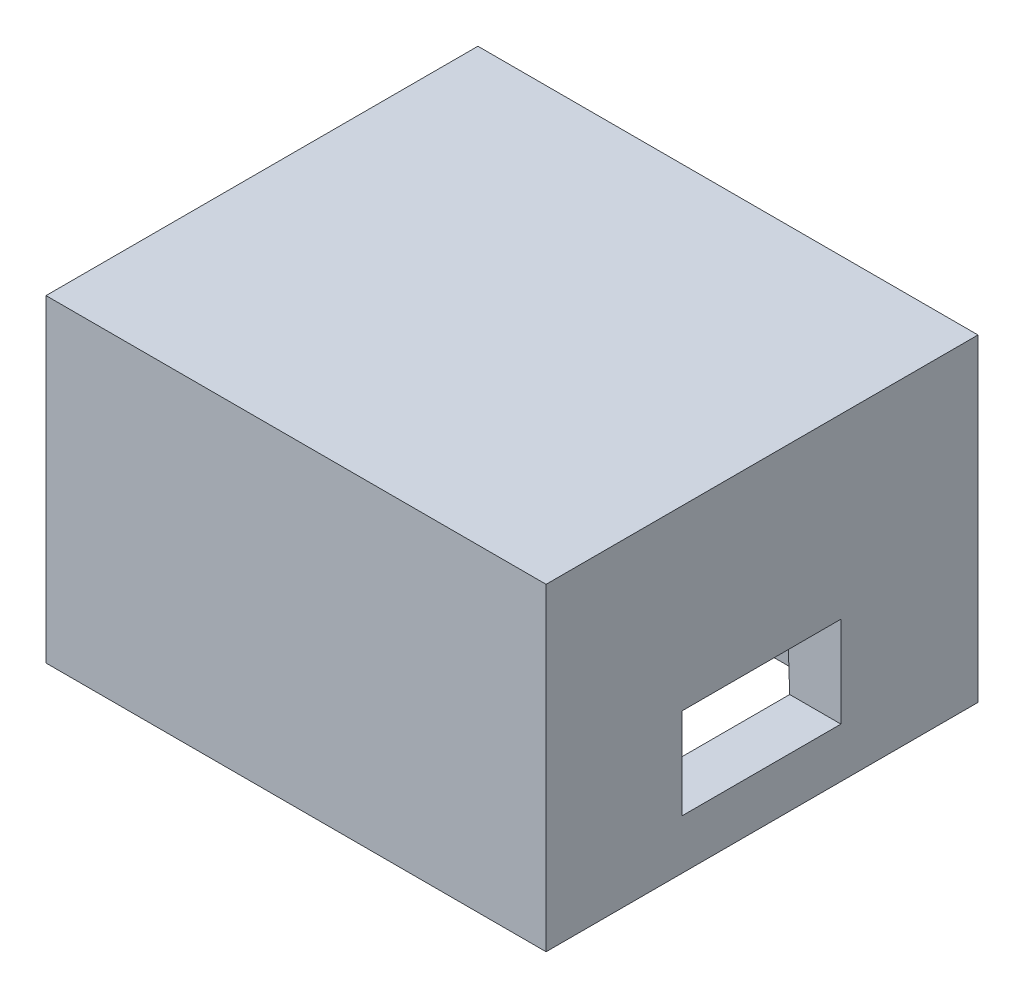
ISO-10303-21;
HEADER;
FILE_DESCRIPTION(('STEP AP214'),'2;1');
FILE_NAME('part.step','',(''),(''),'','','');
FILE_SCHEMA(('AUTOMOTIVE_DESIGN { 1 0 10303 214 1 1 1 1 }'));
ENDSEC;
DATA;
#1=APPLICATION_CONTEXT('core data for automotive mechanical design processes');
#2=APPLICATION_PROTOCOL_DEFINITION('international standard','automotive_design',2000,#1);
#3=PRODUCT_CONTEXT('',#1,'mechanical');
#4=PRODUCT('Part','Part','',(#3));
#5=PRODUCT_RELATED_PRODUCT_CATEGORY('part','',(#4));
#6=PRODUCT_DEFINITION_FORMATION('','',#4);
#7=PRODUCT_DEFINITION_CONTEXT('part definition',#1,'design');
#8=PRODUCT_DEFINITION('design','',#6,#7);
#9=PRODUCT_DEFINITION_SHAPE('','',#8);
#10=(LENGTH_UNIT() NAMED_UNIT(*) SI_UNIT(.MILLI.,.METRE.));
#11=(NAMED_UNIT(*) PLANE_ANGLE_UNIT() SI_UNIT($,.RADIAN.));
#12=(NAMED_UNIT(*) SI_UNIT($,.STERADIAN.) SOLID_ANGLE_UNIT());
#13=UNCERTAINTY_MEASURE_WITH_UNIT(LENGTH_MEASURE(1.E-05),#10,'distance_accuracy_value','');
#14=(GEOMETRIC_REPRESENTATION_CONTEXT(3) GLOBAL_UNCERTAINTY_ASSIGNED_CONTEXT((#13)) GLOBAL_UNIT_ASSIGNED_CONTEXT((#10,
#11,#12)) REPRESENTATION_CONTEXT('',''));
#15=CARTESIAN_POINT('',(0.,0.,0.));
#16=DIRECTION('',(0.,0.,1.));
#17=DIRECTION('',(1.,0.,0.));
#18=AXIS2_PLACEMENT_3D('',#15,#16,#17);
#19=CARTESIAN_POINT('',(43.7308345620287,139.716635550424,17.6499932212532));
#20=DIRECTION('',(0.,-1.,0.));
#21=DIRECTION('',(0.,0.,-1.));
#22=AXIS2_PLACEMENT_3D('',#19,#20,#21);
#23=PLANE('',#22);
#24=DIRECTION('',(0.,0.,-1.));
#25=VECTOR('',#24,1.);
#26=CARTESIAN_POINT('',(55.,139.716635550424,47.5));
#27=LINE('',#26,#25);
#28=CARTESIAN_POINT('',(55.,139.716635550424,17.6499932212532));
#29=VERTEX_POINT('',#28);
#30=CARTESIAN_POINT('',(55.,139.716635550424,-17.3500067787468));
#31=VERTEX_POINT('',#30);
#32=EDGE_CURVE('E212',#29,#31,#27,.T.);
#33=ORIENTED_EDGE('',*,*,#32,.T.);
#34=DIRECTION('',(1.,0.,0.));
#35=VECTOR('',#34,1.);
#36=CARTESIAN_POINT('',(43.7308345620287,139.716635550424,-17.3500067787468));
#37=LINE('',#36,#35);
#38=CARTESIAN_POINT('',(43.7308345620287,139.716635550424,-17.3500067787468));
#39=VERTEX_POINT('',#38);
#40=EDGE_CURVE('E47',#39,#31,#37,.T.);
#41=ORIENTED_EDGE('',*,*,#40,.F.);
#42=DIRECTION('',(0.,0.,-1.));
#43=VECTOR('',#42,1.);
#44=CARTESIAN_POINT('',(43.7308345620287,139.716635550424,-33.6000067787468));
#45=LINE('',#44,#43);
#46=CARTESIAN_POINT('',(43.7308345620287,139.716635550424,17.6499932212532));
#47=VERTEX_POINT('',#46);
#48=EDGE_CURVE('E55',#39,#47,#45,.F.);
#49=ORIENTED_EDGE('',*,*,#48,.T.);
#50=DIRECTION('',(1.,0.,0.));
#51=VECTOR('',#50,1.);
#52=CARTESIAN_POINT('',(43.7308345620287,139.716635550424,17.6499932212532));
#53=LINE('',#52,#51);
#54=EDGE_CURVE('E11',#47,#29,#53,.T.);
#55=ORIENTED_EDGE('',*,*,#54,.T.);
#56=EDGE_LOOP('',(#33,#41,#49,#55));
#57=FACE_BOUND('',#56,.T.);
#58=ADVANCED_FACE('F38',(#57),#23,.F.);
#59=CARTESIAN_POINT('',(43.0328446279787,159.704452090806,17.6499932212532));
#60=DIRECTION('',(0.,0.,1.));
#61=DIRECTION('',(0.,-1.,0.));
#62=AXIS2_PLACEMENT_3D('',#59,#60,#61);
#63=PLANE('',#62);
#64=DIRECTION('',(0.,-1.,0.));
#65=VECTOR('',#64,1.);
#66=CARTESIAN_POINT('',(55.,98.7702927323566,17.6499932212532));
#67=LINE('',#66,#65);
#68=CARTESIAN_POINT('',(55.,159.704452090806,17.6499932212532));
#69=VERTEX_POINT('',#68);
#70=EDGE_CURVE('E216',#69,#29,#67,.T.);
#71=ORIENTED_EDGE('',*,*,#70,.T.);
#72=ORIENTED_EDGE('',*,*,#54,.F.);
#73=DIRECTION('',(0.034899496702501,-0.999390827019096,0.));
#74=VECTOR('',#73,1.);
#75=CARTESIAN_POINT('',(44.1130892763561,128.770292732357,17.6499932212532));
#76=LINE('',#75,#74);
#77=CARTESIAN_POINT('',(43.0328446279787,159.704452090806,17.6499932212532));
#78=VERTEX_POINT('',#77);
#79=EDGE_CURVE('E205',#47,#78,#76,.F.);
#80=ORIENTED_EDGE('',*,*,#79,.T.);
#81=DIRECTION('',(1.,0.,0.));
#82=VECTOR('',#81,1.);
#83=CARTESIAN_POINT('',(43.0328446279787,159.704452090806,17.6499932212532));
#84=LINE('',#83,#82);
#85=EDGE_CURVE('E219',#78,#69,#84,.T.);
#86=ORIENTED_EDGE('',*,*,#85,.T.);
#87=EDGE_LOOP('',(#71,#72,#80,#86));
#88=FACE_BOUND('',#87,.T.);
#89=ADVANCED_FACE('F227',(#88),#63,.F.);
#90=CARTESIAN_POINT('',(43.0328446279787,159.704452090806,17.6499932212532));
#91=DIRECTION('',(0.,1.,0.));
#92=DIRECTION('',(0.,0.,1.));
#93=AXIS2_PLACEMENT_3D('',#90,#91,#92);
#94=PLANE('',#93);
#95=DIRECTION('',(0.,0.,1.));
#96=VECTOR('',#95,1.);
#97=CARTESIAN_POINT('',(55.,159.704452090806,47.5));
#98=LINE('',#97,#96);
#99=CARTESIAN_POINT('',(55.,159.704452090806,-17.3500067787468));
#100=VERTEX_POINT('',#99);
#101=EDGE_CURVE('E213',#100,#69,#98,.T.);
#102=ORIENTED_EDGE('',*,*,#101,.T.);
#103=ORIENTED_EDGE('',*,*,#85,.F.);
#104=DIRECTION('',(0.,0.,1.));
#105=VECTOR('',#104,1.);
#106=CARTESIAN_POINT('',(43.0328446279787,159.704452090806,-33.6000067787468));
#107=LINE('',#106,#105);
#108=CARTESIAN_POINT('',(43.0328446279787,159.704452090806,-17.3500067787468));
#109=VERTEX_POINT('',#108);
#110=EDGE_CURVE('E207',#78,#109,#107,.F.);
#111=ORIENTED_EDGE('',*,*,#110,.T.);
#112=DIRECTION('',(1.,0.,0.));
#113=VECTOR('',#112,1.);
#114=CARTESIAN_POINT('',(43.0328446279787,159.704452090806,-17.3500067787468));
#115=LINE('',#114,#113);
#116=EDGE_CURVE('E204',#109,#100,#115,.T.);
#117=ORIENTED_EDGE('',*,*,#116,.T.);
#118=EDGE_LOOP('',(#102,#103,#111,#117));
#119=FACE_BOUND('',#118,.T.);
#120=ADVANCED_FACE('F237',(#119),#94,.F.);
#121=CARTESIAN_POINT('',(43.0328446279787,159.704452090806,-17.3500067787468));
#122=DIRECTION('',(0.,0.,-1.));
#123=DIRECTION('',(0.,1.,0.));
#124=AXIS2_PLACEMENT_3D('',#121,#122,#123);
#125=PLANE('',#124);
#126=DIRECTION('',(0.,1.,0.));
#127=VECTOR('',#126,1.);
#128=CARTESIAN_POINT('',(55.,98.7702927323566,-17.3500067787468));
#129=LINE('',#128,#127);
#130=EDGE_CURVE('E42',#31,#100,#129,.T.);
#131=ORIENTED_EDGE('',*,*,#130,.T.);
#132=ORIENTED_EDGE('',*,*,#116,.F.);
#133=DIRECTION('',(-0.034899496702501,0.999390827019096,0.));
#134=VECTOR('',#133,1.);
#135=CARTESIAN_POINT('',(44.1130892763561,128.770292732357,-17.3500067787468));
#136=LINE('',#135,#134);
#137=EDGE_CURVE('E209',#109,#39,#136,.F.);
#138=ORIENTED_EDGE('',*,*,#137,.T.);
#139=ORIENTED_EDGE('',*,*,#40,.T.);
#140=EDGE_LOOP('',(#131,#132,#138,#139));
#141=FACE_BOUND('',#140,.T.);
#142=ADVANCED_FACE('F40',(#141),#125,.F.);
#143=CARTESIAN_POINT('',(0.0130892763561168,160.270292732357,21.9935887671255));
#144=DIRECTION('',(1.,0.,0.));
#145=DIRECTION('',(0.,0.,-1.));
#146=AXIS2_PLACEMENT_3D('',#143,#144,#145);
#147=CYLINDRICAL_SURFACE('',#146,10.5);
#148=CARTESIAN_POINT('',(-32.4805062695162,160.270292732357,21.9935887671255));
#149=DIRECTION('',(-1.,0.,0.));
#150=DIRECTION('',(0.,-1.,0.));
#151=AXIS2_PLACEMENT_3D('',#148,#149,#150);
#152=CIRCLE('',#151,10.5);
#153=CARTESIAN_POINT('',(-32.4805062695162,170.770292732357,21.9935887671255));
#154=VERTEX_POINT('',#153);
#155=CARTESIAN_POINT('',(-32.4805062695162,160.636737447733,32.487192450826));
#156=VERTEX_POINT('',#155);
#157=EDGE_CURVE('E787',#154,#156,#152,.F.);
#158=ORIENTED_EDGE('',*,*,#157,.F.);
#159=DIRECTION('',(-1.,0.,0.));
#160=VECTOR('',#159,1.);
#161=CARTESIAN_POINT('',(42.6464169577027,170.770292732357,21.9935887671255));
#162=LINE('',#161,#160);
#163=CARTESIAN_POINT('',(32.5066848222284,170.770292732357,21.9935887671255));
#164=VERTEX_POINT('',#163);
#165=EDGE_CURVE('E756',#154,#164,#162,.F.);
#166=ORIENTED_EDGE('',*,*,#165,.T.);
#167=CARTESIAN_POINT('',(32.5066848222284,160.270292732357,21.9935887671255));
#168=DIRECTION('',(1.,0.,0.));
#169=DIRECTION('',(0.,0.,-1.));
#170=AXIS2_PLACEMENT_3D('',#167,#168,#169);
#171=CIRCLE('',#170,10.5);
#172=CARTESIAN_POINT('',(32.5066848222284,160.636737447733,32.487192450826));
#173=VERTEX_POINT('',#172);
#174=EDGE_CURVE('E751',#173,#164,#171,.F.);
#175=ORIENTED_EDGE('',*,*,#174,.F.);
#176=DIRECTION('',(1.,0.,0.));
#177=VECTOR('',#176,1.);
#178=CARTESIAN_POINT('',(-42.6202384049905,160.636737447733,32.487192450826));
#179=LINE('',#178,#177);
#180=EDGE_CURVE('E735',#173,#156,#179,.F.);
#181=ORIENTED_EDGE('',*,*,#180,.T.);
#182=EDGE_LOOP('',(#158,#166,#175,#181));
#183=FACE_BOUND('',#182,.T.);
#184=ADVANCED_FACE('F246',(#183),#147,.F.);
#185=CARTESIAN_POINT('',(-32.4805062695162,160.270292732357,21.9935887671255));
#186=DIRECTION('',(0.,0.,1.));
#187=DIRECTION('',(1.,0.,0.));
#188=AXIS2_PLACEMENT_3D('',#185,#186,#187);
#189=SPHERICAL_SURFACE('',#188,10.5);
#190=CARTESIAN_POINT('',(-32.4805062695162,160.270292732357,21.9935887671255));
#191=DIRECTION('',(0.,0.,1.));
#192=DIRECTION('',(1.,0.,0.));
#193=AXIS2_PLACEMENT_3D('',#190,#191,#192);
#194=CIRCLE('',#193,10.5);
#195=CARTESIAN_POINT('',(-42.9741099532167,160.636737447733,21.9935887671255));
#196=VERTEX_POINT('',#195);
#197=EDGE_CURVE('E780',#154,#196,#194,.T.);
#198=ORIENTED_EDGE('',*,*,#197,.F.);
#199=ORIENTED_EDGE('',*,*,#157,.T.);
#200=CARTESIAN_POINT('',(-32.4805062695162,160.270292732357,21.9935887671255));
#201=DIRECTION('',(0.0348782627423747,0.998782765958718,-0.0348782627423747));
#202=DIRECTION('',(0.,0.0348994967025011,0.999390827019096));
#203=AXIS2_PLACEMENT_3D('',#200,#201,#202);
#204=CIRCLE('',#203,10.5);
#205=EDGE_CURVE('E783',#196,#156,#204,.T.);
#206=ORIENTED_EDGE('',*,*,#205,.F.);
#207=EDGE_LOOP('',(#198,#199,#206));
#208=FACE_BOUND('',#207,.T.);
#209=ADVANCED_FACE('F350',(#208),#189,.F.);
#210=CARTESIAN_POINT('',(-32.4805062695162,160.270292732357,-6.77874678040114E-06));
#211=DIRECTION('',(0.,0.,1.));
#212=DIRECTION('',(1.,0.,0.));
#213=AXIS2_PLACEMENT_3D('',#210,#211,#212);
#214=CYLINDRICAL_SURFACE('',#213,10.5);
#215=CARTESIAN_POINT('',(-32.4805062695162,160.270292732357,-21.9936023246191));
#216=DIRECTION('',(0.,0.,-1.));
#217=DIRECTION('',(-1.,0.,0.));
#218=AXIS2_PLACEMENT_3D('',#215,#216,#217);
#219=CIRCLE('',#218,10.5);
#220=CARTESIAN_POINT('',(-32.4805062695162,170.770292732357,-21.9936023246191));
#221=VERTEX_POINT('',#220);
#222=CARTESIAN_POINT('',(-42.9741099532167,160.636737447733,-21.9936023246191));
#223=VERTEX_POINT('',#222);
#224=EDGE_CURVE('E773',#221,#223,#219,.F.);
#225=ORIENTED_EDGE('',*,*,#224,.F.);
#226=DIRECTION('',(0.,0.,-1.));
#227=VECTOR('',#226,1.);
#228=CARTESIAN_POINT('',(-32.4805062695162,170.770292732357,32.1333209025998));
#229=LINE('',#228,#227);
#230=EDGE_CURVE('E774',#221,#154,#229,.F.);
#231=ORIENTED_EDGE('',*,*,#230,.T.);
#232=ORIENTED_EDGE('',*,*,#197,.T.);
#233=DIRECTION('',(0.,0.,1.));
#234=VECTOR('',#233,1.);
#235=CARTESIAN_POINT('',(-42.9741099532167,160.636737447733,-32.1333344600934));
#236=LINE('',#235,#234);
#237=EDGE_CURVE('E733',#196,#223,#236,.F.);
#238=ORIENTED_EDGE('',*,*,#237,.T.);
#239=EDGE_LOOP('',(#225,#231,#232,#238));
#240=FACE_BOUND('',#239,.T.);
#241=ADVANCED_FACE('F346',(#240),#214,.F.);
#242=CARTESIAN_POINT('',(-32.4805062695162,160.270292732357,-21.9936023246191));
#243=DIRECTION('',(0.,0.,1.));
#244=DIRECTION('',(1.,0.,0.));
#245=AXIS2_PLACEMENT_3D('',#242,#243,#244);
#246=SPHERICAL_SURFACE('',#245,10.5);
#247=CARTESIAN_POINT('',(-32.4805062695162,160.270292732357,-21.9936023246191));
#248=DIRECTION('',(-1.,0.,0.));
#249=DIRECTION('',(0.,0.,1.));
#250=AXIS2_PLACEMENT_3D('',#247,#248,#249);
#251=CIRCLE('',#250,10.5);
#252=CARTESIAN_POINT('',(-32.4805062695162,160.636737447733,-32.4872060083196));
#253=VERTEX_POINT('',#252);
#254=EDGE_CURVE('E769',#221,#253,#251,.T.);
#255=ORIENTED_EDGE('',*,*,#254,.F.);
#256=ORIENTED_EDGE('',*,*,#224,.T.);
#257=CARTESIAN_POINT('',(-32.4805062695162,160.270292732357,-21.9936023246191));
#258=DIRECTION('',(0.0348782627423747,0.998782765958718,0.0348782627423747));
#259=DIRECTION('',(0.,-0.034899496702501,0.999390827019096));
#260=AXIS2_PLACEMENT_3D('',#257,#258,#259);
#261=CIRCLE('',#260,10.5);
#262=EDGE_CURVE('E688',#253,#223,#261,.T.);
#263=ORIENTED_EDGE('',*,*,#262,.F.);
#264=EDGE_LOOP('',(#255,#256,#263));
#265=FACE_BOUND('',#264,.T.);
#266=ADVANCED_FACE('F342',(#265),#246,.F.);
#267=CARTESIAN_POINT('',(0.0130892763561168,160.270292732357,-21.9936023246191));
#268=DIRECTION('',(-1.,0.,0.));
#269=DIRECTION('',(0.,0.,1.));
#270=AXIS2_PLACEMENT_3D('',#267,#268,#269);
#271=CYLINDRICAL_SURFACE('',#270,10.5);
#272=CARTESIAN_POINT('',(32.5066848222284,160.270292732357,-21.9936023246191));
#273=DIRECTION('',(1.,0.,0.));
#274=DIRECTION('',(0.,1.,0.));
#275=AXIS2_PLACEMENT_3D('',#272,#273,#274);
#276=CIRCLE('',#275,10.5);
#277=CARTESIAN_POINT('',(32.5066848222284,160.636737447733,-32.4872060083196));
#278=VERTEX_POINT('',#277);
#279=CARTESIAN_POINT('',(32.5066848222284,170.770292732357,-21.9936023246191));
#280=VERTEX_POINT('',#279);
#281=EDGE_CURVE('E763',#278,#280,#276,.T.);
#282=ORIENTED_EDGE('',*,*,#281,.T.);
#283=DIRECTION('',(1.,0.,0.));
#284=VECTOR('',#283,1.);
#285=CARTESIAN_POINT('',(-42.6202384049905,170.770292732357,-21.9936023246191));
#286=LINE('',#285,#284);
#287=EDGE_CURVE('E755',#280,#221,#286,.F.);
#288=ORIENTED_EDGE('',*,*,#287,.T.);
#289=ORIENTED_EDGE('',*,*,#254,.T.);
#290=DIRECTION('',(-1.,0.,0.));
#291=VECTOR('',#290,1.);
#292=CARTESIAN_POINT('',(42.6464169577027,160.636737447733,-32.4872060083196));
#293=LINE('',#292,#291);
#294=EDGE_CURVE('E676',#253,#278,#293,.F.);
#295=ORIENTED_EDGE('',*,*,#294,.T.);
#296=EDGE_LOOP('',(#282,#288,#289,#295));
#297=FACE_BOUND('',#296,.T.);
#298=ADVANCED_FACE('F322',(#297),#271,.F.);
#299=CARTESIAN_POINT('',(0.0130892763561168,170.770292732357,-6.77874678040114E-06));
#300=DIRECTION('',(0.,1.,0.));
#301=DIRECTION('',(0.,0.,1.));
#302=AXIS2_PLACEMENT_3D('',#299,#300,#301);
#303=PLANE('',#302);
#304=ORIENTED_EDGE('',*,*,#230,.F.);
#305=ORIENTED_EDGE('',*,*,#287,.F.);
#306=DIRECTION('',(0.,0.,1.));
#307=VECTOR('',#306,1.);
#308=CARTESIAN_POINT('',(32.5066848222284,170.770292732357,-32.1333344600934));
#309=LINE('',#308,#307);
#310=EDGE_CURVE('E752',#164,#280,#309,.F.);
#311=ORIENTED_EDGE('',*,*,#310,.F.);
#312=ORIENTED_EDGE('',*,*,#165,.F.);
#313=EDGE_LOOP('',(#304,#305,#311,#312));
#314=FACE_BOUND('',#313,.T.);
#315=ADVANCED_FACE('F319',(#314),#303,.F.);
#316=CARTESIAN_POINT('',(32.5066848222284,160.270292732357,-21.9936023246191));
#317=DIRECTION('',(0.,0.,1.));
#318=DIRECTION('',(1.,0.,0.));
#319=AXIS2_PLACEMENT_3D('',#316,#317,#318);
#320=SPHERICAL_SURFACE('',#319,10.5);
#321=CARTESIAN_POINT('',(32.5066848222284,160.270292732357,-21.9936023246191));
#322=DIRECTION('',(-0.0348782627423747,0.998782765958718,0.0348782627423747));
#323=DIRECTION('',(0.,-0.0348994967025011,0.999390827019096));
#324=AXIS2_PLACEMENT_3D('',#321,#322,#323);
#325=CIRCLE('',#324,10.5);
#326=CARTESIAN_POINT('',(43.0002885059289,160.636737447733,-21.9936023246191));
#327=VERTEX_POINT('',#326);
#328=EDGE_CURVE('E663',#327,#278,#325,.T.);
#329=ORIENTED_EDGE('',*,*,#328,.F.);
#330=CARTESIAN_POINT('',(32.5066848222284,160.270292732357,-21.9936023246191));
#331=DIRECTION('',(0.,0.,-1.));
#332=DIRECTION('',(-1.,0.,0.));
#333=AXIS2_PLACEMENT_3D('',#330,#331,#332);
#334=CIRCLE('',#333,10.5);
#335=EDGE_CURVE('E758',#327,#280,#334,.F.);
#336=ORIENTED_EDGE('',*,*,#335,.T.);
#337=ORIENTED_EDGE('',*,*,#281,.F.);
#338=EDGE_LOOP('',(#329,#336,#337));
#339=FACE_BOUND('',#338,.T.);
#340=ADVANCED_FACE('F317',(#339),#320,.F.);
#341=CARTESIAN_POINT('',(32.5066848222284,160.270292732357,21.9935887671255));
#342=DIRECTION('',(0.,0.,1.));
#343=DIRECTION('',(1.,0.,0.));
#344=AXIS2_PLACEMENT_3D('',#341,#342,#343);
#345=SPHERICAL_SURFACE('',#344,10.5);
#346=CARTESIAN_POINT('',(32.5066848222284,160.270292732357,21.9935887671255));
#347=DIRECTION('',(-0.0348782627423747,0.998782765958718,-0.0348782627423747));
#348=DIRECTION('',(0.,0.034899496702501,0.999390827019096));
#349=AXIS2_PLACEMENT_3D('',#346,#347,#348);
#350=CIRCLE('',#349,10.5);
#351=CARTESIAN_POINT('',(43.0002885059289,160.636737447733,21.9935887671255));
#352=VERTEX_POINT('',#351);
#353=EDGE_CURVE('E729',#173,#352,#350,.T.);
#354=ORIENTED_EDGE('',*,*,#353,.F.);
#355=ORIENTED_EDGE('',*,*,#174,.T.);
#356=CARTESIAN_POINT('',(32.5066848222284,160.270292732357,21.9935887671255));
#357=DIRECTION('',(0.,0.,1.));
#358=DIRECTION('',(1.,0.,0.));
#359=AXIS2_PLACEMENT_3D('',#356,#357,#358);
#360=CIRCLE('',#359,10.5);
#361=EDGE_CURVE('E745',#352,#164,#360,.T.);
#362=ORIENTED_EDGE('',*,*,#361,.F.);
#363=EDGE_LOOP('',(#354,#355,#362));
#364=FACE_BOUND('',#363,.T.);
#365=ADVANCED_FACE('F313',(#364),#345,.F.);
#366=CARTESIAN_POINT('',(-44.0869107236439,128.770292732357,33.5999932212532));
#367=DIRECTION('',(0.,0.034899496702501,0.999390827019096));
#368=DIRECTION('',(0.,-0.999390827019096,0.034899496702501));
#369=AXIS2_PLACEMENT_3D('',#366,#367,#368);
#370=PLANE('',#369);
#371=ORIENTED_EDGE('',*,*,#180,.F.);
#372=DIRECTION('',(-0.0348782627423747,0.998782765958718,-0.0348782627423747));
#373=VECTOR('',#372,1.);
#374=CARTESIAN_POINT('',(33.5249562890136,131.477257814107,33.5054639176112));
#375=LINE('',#374,#373);
#376=CARTESIAN_POINT('',(33.6194855926556,128.770292732357,33.5999932212532));
#377=VERTEX_POINT('',#376);
#378=EDGE_CURVE('E744',#377,#173,#375,.T.);
#379=ORIENTED_EDGE('',*,*,#378,.F.);
#380=DIRECTION('',(1.,0.,0.));
#381=VECTOR('',#380,1.);
#382=CARTESIAN_POINT('',(-44.0869107236439,128.770292732357,33.5999932212532));
#383=LINE('',#382,#381);
#384=CARTESIAN_POINT('',(-33.5933070399434,128.770292732357,33.5999932212532));
#385=VERTEX_POINT('',#384);
#386=EDGE_CURVE('E252',#385,#377,#383,.T.);
#387=ORIENTED_EDGE('',*,*,#386,.F.);
#388=DIRECTION('',(0.0348782627423747,0.998782765958718,-0.0348782627423747));
#389=VECTOR('',#388,1.);
#390=CARTESIAN_POINT('',(-33.6060724375932,128.404739571998,33.6127586189031));
#391=LINE('',#390,#389);
#392=EDGE_CURVE('E265',#156,#385,#391,.F.);
#393=ORIENTED_EDGE('',*,*,#392,.F.);
#394=EDGE_LOOP('',(#371,#379,#387,#393));
#395=FACE_BOUND('',#394,.T.);
#396=ADVANCED_FACE('F316',(#395),#370,.F.);
#397=CARTESIAN_POINT('',(-33.6060724375932,128.038294856622,23.1191549352026));
#398=DIRECTION('',(-0.0348782627423747,-0.998782765958718,0.0348782627423747));
#399=DIRECTION('',(0.,-0.034899496702501,-0.999390827019096));
#400=AXIS2_PLACEMENT_3D('',#397,#398,#399);
#401=CYLINDRICAL_SURFACE('',#400,10.5);
#402=CARTESIAN_POINT('',(-33.5805105085063,128.770292732357,23.0935930061156));
#403=DIRECTION('',(0.,1.,0.));
#404=DIRECTION('',(-0.707106781186548,0.,0.707106781186547));
#405=AXIS2_PLACEMENT_3D('',#402,#403,#404);
#406=ELLIPSE('',#405,10.51279653381,10.5);
#407=CARTESIAN_POINT('',(-44.0869107236439,128.770292732357,23.1063895375527));
#408=VERTEX_POINT('',#407);
#409=EDGE_CURVE('E250',#385,#408,#406,.F.);
#410=ORIENTED_EDGE('',*,*,#409,.T.);
#411=DIRECTION('',(0.0348782627423747,0.998782765958718,-0.0348782627423747));
#412=VECTOR('',#411,1.);
#413=CARTESIAN_POINT('',(-44.0179277774523,130.7457058517,23.0374065913611));
#414=LINE('',#413,#412);
#415=EDGE_CURVE('E700',#408,#196,#414,.T.);
#416=ORIENTED_EDGE('',*,*,#415,.T.);
#417=ORIENTED_EDGE('',*,*,#205,.T.);
#418=ORIENTED_EDGE('',*,*,#392,.T.);
#419=EDGE_LOOP('',(#410,#416,#417,#418));
#420=FACE_BOUND('',#419,.T.);
#421=ADVANCED_FACE('F332',(#420),#401,.F.);
#422=CARTESIAN_POINT('',(-44.0869107236439,128.770292732357,-33.6000067787468));
#423=DIRECTION('',(-0.999390827019096,0.034899496702501,0.));
#424=DIRECTION('',(-0.034899496702501,-0.999390827019096,0.));
#425=AXIS2_PLACEMENT_3D('',#422,#423,#424);
#426=PLANE('',#425);
#427=DIRECTION('',(0.,0.,1.));
#428=VECTOR('',#427,1.);
#429=CARTESIAN_POINT('',(-44.0869107236439,128.770292732357,-33.6000067787468));
#430=LINE('',#429,#428);
#431=CARTESIAN_POINT('',(-44.0869107236439,128.770292732357,-23.1064030950463));
#432=VERTEX_POINT('',#431);
#433=EDGE_CURVE('E695',#432,#408,#430,.T.);
#434=ORIENTED_EDGE('',*,*,#433,.F.);
#435=DIRECTION('',(0.0348782627423747,0.998782765958718,0.0348782627423747));
#436=VECTOR('',#435,1.);
#437=CARTESIAN_POINT('',(-44.0996761212937,128.404739571998,-23.1191684926961));
#438=LINE('',#437,#436);
#439=EDGE_CURVE('E689',#223,#432,#438,.F.);
#440=ORIENTED_EDGE('',*,*,#439,.F.);
#441=ORIENTED_EDGE('',*,*,#237,.F.);
#442=ORIENTED_EDGE('',*,*,#415,.F.);
#443=EDGE_LOOP('',(#434,#440,#441,#442));
#444=FACE_BOUND('',#443,.T.);
#445=ADVANCED_FACE('F329',(#444),#426,.F.);
#446=CARTESIAN_POINT('',(-33.6060724375932,128.038294856622,-23.1191684926961));
#447=DIRECTION('',(-0.0348782627423747,-0.998782765958718,-0.0348782627423747));
#448=DIRECTION('',(0.,0.034899496702501,-0.999390827019096));
#449=AXIS2_PLACEMENT_3D('',#446,#447,#448);
#450=CYLINDRICAL_SURFACE('',#449,10.5);
#451=CARTESIAN_POINT('',(-33.5805105085063,128.770292732357,-23.0936065636092));
#452=DIRECTION('',(0.,1.,0.));
#453=DIRECTION('',(-0.707106781186548,0.,-0.707106781186548));
#454=AXIS2_PLACEMENT_3D('',#451,#452,#453);
#455=ELLIPSE('',#454,10.51279653381,10.5);
#456=CARTESIAN_POINT('',(-33.5933070399434,128.770292732357,-33.6000067787468));
#457=VERTEX_POINT('',#456);
#458=EDGE_CURVE('E684',#432,#457,#455,.F.);
#459=ORIENTED_EDGE('',*,*,#458,.T.);
#460=DIRECTION('',(0.0348782627423747,0.998782765958718,0.0348782627423747));
#461=VECTOR('',#460,1.);
#462=CARTESIAN_POINT('',(-33.6060724375932,128.404739571998,-33.6127721763967));
#463=LINE('',#462,#461);
#464=EDGE_CURVE('E677',#457,#253,#463,.T.);
#465=ORIENTED_EDGE('',*,*,#464,.T.);
#466=ORIENTED_EDGE('',*,*,#262,.T.);
#467=ORIENTED_EDGE('',*,*,#439,.T.);
#468=EDGE_LOOP('',(#459,#465,#466,#467));
#469=FACE_BOUND('',#468,.T.);
#470=ADVANCED_FACE('F290',(#469),#450,.F.);
#471=CARTESIAN_POINT('',(-44.0869107236439,128.770292732357,-33.6000067787468));
#472=DIRECTION('',(0.,0.034899496702501,-0.999390827019096));
#473=DIRECTION('',(0.,0.999390827019096,0.034899496702501));
#474=AXIS2_PLACEMENT_3D('',#471,#472,#473);
#475=PLANE('',#474);
#476=DIRECTION('',(-1.,0.,0.));
#477=VECTOR('',#476,1.);
#478=CARTESIAN_POINT('',(-44.0869107236439,128.770292732357,-33.6000067787468));
#479=LINE('',#478,#477);
#480=CARTESIAN_POINT('',(33.6194855926556,128.770292732357,-33.6000067787468));
#481=VERTEX_POINT('',#480);
#482=EDGE_CURVE('E670',#481,#457,#479,.T.);
#483=ORIENTED_EDGE('',*,*,#482,.F.);
#484=DIRECTION('',(-0.0348782627423747,0.998782765958718,0.0348782627423747));
#485=VECTOR('',#484,1.);
#486=CARTESIAN_POINT('',(33.5249562890136,131.477257814107,-33.5054774751048));
#487=LINE('',#486,#485);
#488=EDGE_CURVE('E664',#278,#481,#487,.F.);
#489=ORIENTED_EDGE('',*,*,#488,.F.);
#490=ORIENTED_EDGE('',*,*,#294,.F.);
#491=ORIENTED_EDGE('',*,*,#464,.F.);
#492=EDGE_LOOP('',(#483,#489,#490,#491));
#493=FACE_BOUND('',#492,.T.);
#494=ADVANCED_FACE('F283',(#493),#475,.F.);
#495=CARTESIAN_POINT('',(-55.,98.7702927323566,47.5));
#496=DIRECTION('',(-1.,0.,0.));
#497=DIRECTION('',(0.,0.,1.));
#498=AXIS2_PLACEMENT_3D('',#495,#496,#497);
#499=PLANE('',#498);
#500=DIRECTION('',(0.,0.,-1.));
#501=VECTOR('',#500,1.);
#502=CARTESIAN_POINT('',(-55.,128.770292732357,47.5));
#503=LINE('',#502,#501);
#504=CARTESIAN_POINT('',(-55.,128.770292732357,47.5));
#505=VERTEX_POINT('',#504);
#506=CARTESIAN_POINT('',(-55.,128.770292732357,-47.5));
#507=VERTEX_POINT('',#506);
#508=EDGE_CURVE('E196',#505,#507,#503,.T.);
#509=ORIENTED_EDGE('',*,*,#508,.F.);
#510=DIRECTION('',(0.,1.,0.));
#511=VECTOR('',#510,1.);
#512=CARTESIAN_POINT('',(-55.,98.7702927323566,47.5));
#513=LINE('',#512,#511);
#514=CARTESIAN_POINT('',(-55.,198.770292732357,47.5));
#515=VERTEX_POINT('',#514);
#516=EDGE_CURVE('E197',#505,#515,#513,.T.);
#517=ORIENTED_EDGE('',*,*,#516,.T.);
#518=DIRECTION('',(0.,0.,1.));
#519=VECTOR('',#518,1.);
#520=CARTESIAN_POINT('',(-55.,198.770292732357,47.5));
#521=LINE('',#520,#519);
#522=CARTESIAN_POINT('',(-55.,198.770292732357,-47.5));
#523=VERTEX_POINT('',#522);
#524=EDGE_CURVE('E184',#523,#515,#521,.T.);
#525=ORIENTED_EDGE('',*,*,#524,.F.);
#526=DIRECTION('',(0.,1.,0.));
#527=VECTOR('',#526,1.);
#528=CARTESIAN_POINT('',(-55.,98.7702927323566,-47.5));
#529=LINE('',#528,#527);
#530=EDGE_CURVE('E174',#507,#523,#529,.T.);
#531=ORIENTED_EDGE('',*,*,#530,.F.);
#532=EDGE_LOOP('',(#509,#517,#525,#531));
#533=FACE_BOUND('',#532,.T.);
#534=ADVANCED_FACE('F281',(#533),#499,.T.);
#535=CARTESIAN_POINT('',(-55.,98.7702927323566,47.5));
#536=DIRECTION('',(0.,0.,1.));
#537=DIRECTION('',(1.,0.,0.));
#538=AXIS2_PLACEMENT_3D('',#535,#536,#537);
#539=PLANE('',#538);
#540=DIRECTION('',(-1.,0.,0.));
#541=VECTOR('',#540,1.);
#542=CARTESIAN_POINT('',(-55.,128.770292732357,47.5));
#543=LINE('',#542,#541);
#544=CARTESIAN_POINT('',(55.,128.770292732357,47.5));
#545=VERTEX_POINT('',#544);
#546=EDGE_CURVE('E271',#545,#505,#543,.T.);
#547=ORIENTED_EDGE('',*,*,#546,.F.);
#548=DIRECTION('',(0.,1.,0.));
#549=VECTOR('',#548,1.);
#550=CARTESIAN_POINT('',(55.,98.7702927323566,47.5));
#551=LINE('',#550,#549);
#552=CARTESIAN_POINT('',(55.,198.770292732357,47.5));
#553=VERTEX_POINT('',#552);
#554=EDGE_CURVE('E194',#545,#553,#551,.T.);
#555=ORIENTED_EDGE('',*,*,#554,.T.);
#556=DIRECTION('',(1.,0.,0.));
#557=VECTOR('',#556,1.);
#558=CARTESIAN_POINT('',(-55.,198.770292732357,47.5));
#559=LINE('',#558,#557);
#560=EDGE_CURVE('E175',#515,#553,#559,.T.);
#561=ORIENTED_EDGE('',*,*,#560,.F.);
#562=ORIENTED_EDGE('',*,*,#516,.F.);
#563=EDGE_LOOP('',(#547,#555,#561,#562));
#564=FACE_BOUND('',#563,.T.);
#565=ADVANCED_FACE('F279',(#564),#539,.T.);
#566=CARTESIAN_POINT('',(0.,198.770292732357,0.));
#567=DIRECTION('',(0.,-1.,0.));
#568=DIRECTION('',(0.,0.,-1.));
#569=AXIS2_PLACEMENT_3D('',#566,#567,#568);
#570=PLANE('',#569);
#571=DIRECTION('',(0.,0.,-1.));
#572=VECTOR('',#571,1.);
#573=CARTESIAN_POINT('',(55.,198.770292732357,47.5));
#574=LINE('',#573,#572);
#575=CARTESIAN_POINT('',(55.,198.770292732357,-47.5));
#576=VERTEX_POINT('',#575);
#577=EDGE_CURVE('E169',#553,#576,#574,.T.);
#578=ORIENTED_EDGE('',*,*,#577,.T.);
#579=DIRECTION('',(-1.,0.,0.));
#580=VECTOR('',#579,1.);
#581=CARTESIAN_POINT('',(-55.,198.770292732357,-47.5));
#582=LINE('',#581,#580);
#583=EDGE_CURVE('E178',#576,#523,#582,.T.);
#584=ORIENTED_EDGE('',*,*,#583,.T.);
#585=ORIENTED_EDGE('',*,*,#524,.T.);
#586=ORIENTED_EDGE('',*,*,#560,.T.);
#587=EDGE_LOOP('',(#578,#584,#585,#586));
#588=FACE_BOUND('',#587,.T.);
#589=ADVANCED_FACE('F186',(#588),#570,.F.);
#590=CARTESIAN_POINT('',(-55.,98.7702927323566,-47.5));
#591=DIRECTION('',(0.,0.,-1.));
#592=DIRECTION('',(-1.,0.,0.));
#593=AXIS2_PLACEMENT_3D('',#590,#591,#592);
#594=PLANE('',#593);
#595=DIRECTION('',(1.,0.,0.));
#596=VECTOR('',#595,1.);
#597=CARTESIAN_POINT('',(-55.,128.770292732357,-47.5));
#598=LINE('',#597,#596);
#599=CARTESIAN_POINT('',(55.,128.770292732357,-47.5));
#600=VERTEX_POINT('',#599);
#601=EDGE_CURVE('E200',#507,#600,#598,.T.);
#602=ORIENTED_EDGE('',*,*,#601,.F.);
#603=ORIENTED_EDGE('',*,*,#530,.T.);
#604=ORIENTED_EDGE('',*,*,#583,.F.);
#605=DIRECTION('',(0.,1.,0.));
#606=VECTOR('',#605,1.);
#607=CARTESIAN_POINT('',(55.,98.7702927323566,-47.5));
#608=LINE('',#607,#606);
#609=EDGE_CURVE('E164',#600,#576,#608,.T.);
#610=ORIENTED_EDGE('',*,*,#609,.F.);
#611=EDGE_LOOP('',(#602,#603,#604,#610));
#612=FACE_BOUND('',#611,.T.);
#613=ADVANCED_FACE('F179',(#612),#594,.T.);
#614=CARTESIAN_POINT('',(33.5249562890136,131.110813098731,-23.0118737914043));
#615=DIRECTION('',(0.0348782627423747,-0.998782765958718,-0.0348782627423747));
#616=DIRECTION('',(0.,0.034899496702501,-0.999390827019096));
#617=AXIS2_PLACEMENT_3D('',#614,#615,#616);
#618=CYLINDRICAL_SURFACE('',#617,10.5);
#619=CARTESIAN_POINT('',(33.6066890612185,128.770292732357,-23.0936065636092));
#620=DIRECTION('',(0.,1.,0.));
#621=DIRECTION('',(0.707106781186547,0.,-0.707106781186548));
#622=AXIS2_PLACEMENT_3D('',#619,#620,#621);
#623=ELLIPSE('',#622,10.51279653381,10.5);
#624=CARTESIAN_POINT('',(44.1130892763561,128.770292732357,-23.1064030950463));
#625=VERTEX_POINT('',#624);
#626=EDGE_CURVE('E269',#481,#625,#623,.F.);
#627=ORIENTED_EDGE('',*,*,#626,.T.);
#628=DIRECTION('',(-0.0348782627423747,0.998782765958718,0.0348782627423747));
#629=VECTOR('',#628,1.);
#630=CARTESIAN_POINT('',(44.125854674006,128.404739571998,-23.1191684926961));
#631=LINE('',#630,#629);
#632=EDGE_CURVE('E701',#625,#327,#631,.T.);
#633=ORIENTED_EDGE('',*,*,#632,.T.);
#634=ORIENTED_EDGE('',*,*,#328,.T.);
#635=ORIENTED_EDGE('',*,*,#488,.T.);
#636=EDGE_LOOP('',(#627,#633,#634,#635));
#637=FACE_BOUND('',#636,.T.);
#638=ADVANCED_FACE('F295',(#637),#618,.F.);
#639=CARTESIAN_POINT('',(32.5066848222284,160.270292732357,-6.77874678040114E-06));
#640=DIRECTION('',(0.,0.,-1.));
#641=DIRECTION('',(-1.,0.,0.));
#642=AXIS2_PLACEMENT_3D('',#639,#640,#641);
#643=CYLINDRICAL_SURFACE('',#642,10.5);
#644=ORIENTED_EDGE('',*,*,#335,.F.);
#645=DIRECTION('',(0.,0.,-1.));
#646=VECTOR('',#645,1.);
#647=CARTESIAN_POINT('',(43.0002885059289,160.636737447733,32.1333209025998));
#648=LINE('',#647,#646);
#649=EDGE_CURVE('E712',#327,#352,#648,.F.);
#650=ORIENTED_EDGE('',*,*,#649,.T.);
#651=ORIENTED_EDGE('',*,*,#361,.T.);
#652=ORIENTED_EDGE('',*,*,#310,.T.);
#653=EDGE_LOOP('',(#644,#650,#651,#652));
#654=FACE_BOUND('',#653,.T.);
#655=ADVANCED_FACE('F300',(#654),#643,.F.);
#656=CARTESIAN_POINT('',(33.550502646464,130.379261136324,23.0374065913611));
#657=DIRECTION('',(0.0348782627423747,-0.998782765958718,0.0348782627423747));
#658=DIRECTION('',(0.,-0.034899496702501,-0.999390827019096));
#659=AXIS2_PLACEMENT_3D('',#656,#657,#658);
#660=CYLINDRICAL_SURFACE('',#659,10.5);
#661=CARTESIAN_POINT('',(33.6066890612185,128.770292732357,23.0935930061156));
#662=DIRECTION('',(0.,1.,0.));
#663=DIRECTION('',(0.707106781186548,0.,0.707106781186548));
#664=AXIS2_PLACEMENT_3D('',#661,#662,#663);
#665=ELLIPSE('',#664,10.51279653381,10.5);
#666=CARTESIAN_POINT('',(44.1130892763561,128.770292732357,23.1063895375527));
#667=VERTEX_POINT('',#666);
#668=EDGE_CURVE('E202',#667,#377,#665,.F.);
#669=ORIENTED_EDGE('',*,*,#668,.T.);
#670=ORIENTED_EDGE('',*,*,#378,.T.);
#671=ORIENTED_EDGE('',*,*,#353,.T.);
#672=DIRECTION('',(-0.0348782627423747,0.998782765958718,-0.0348782627423747));
#673=VECTOR('',#672,1.);
#674=CARTESIAN_POINT('',(44.0441063301645,130.7457058517,23.0374065913611));
#675=LINE('',#674,#673);
#676=EDGE_CURVE('E721',#352,#667,#675,.F.);
#677=ORIENTED_EDGE('',*,*,#676,.T.);
#678=EDGE_LOOP('',(#669,#670,#671,#677));
#679=FACE_BOUND('',#678,.T.);
#680=ADVANCED_FACE('F309',(#679),#660,.F.);
#681=CARTESIAN_POINT('',(44.1130892763561,128.770292732357,23.1063895375527));
#682=DIRECTION('',(0.,1.,0.));
#683=DIRECTION('',(-0.707106781186549,0.,0.707106781186546));
#684=AXIS2_PLACEMENT_3D('',#681,#682,#683);
#685=PLANE('',#684);
#686=DIRECTION('',(0.,0.,1.));
#687=VECTOR('',#686,1.);
#688=CARTESIAN_POINT('',(55.,128.770292732357,47.5));
#689=LINE('',#688,#687);
#690=EDGE_CURVE('E171',#600,#545,#689,.T.);
#691=ORIENTED_EDGE('',*,*,#690,.T.);
#692=ORIENTED_EDGE('',*,*,#546,.T.);
#693=ORIENTED_EDGE('',*,*,#508,.T.);
#694=ORIENTED_EDGE('',*,*,#601,.T.);
#695=EDGE_LOOP('',(#691,#692,#693,#694));
#696=FACE_BOUND('',#695,.T.);
#697=ORIENTED_EDGE('',*,*,#668,.F.);
#698=DIRECTION('',(0.,0.,-1.));
#699=VECTOR('',#698,1.);
#700=CARTESIAN_POINT('',(44.1130892763561,128.770292732357,-33.6000067787468));
#701=LINE('',#700,#699);
#702=EDGE_CURVE('E707',#667,#625,#701,.T.);
#703=ORIENTED_EDGE('',*,*,#702,.T.);
#704=ORIENTED_EDGE('',*,*,#626,.F.);
#705=ORIENTED_EDGE('',*,*,#482,.T.);
#706=ORIENTED_EDGE('',*,*,#458,.F.);
#707=ORIENTED_EDGE('',*,*,#433,.T.);
#708=ORIENTED_EDGE('',*,*,#409,.F.);
#709=ORIENTED_EDGE('',*,*,#386,.T.);
#710=EDGE_LOOP('',(#697,#703,#704,#705,#706,#707,#708,#709));
#711=FACE_BOUND('',#710,.T.);
#712=ADVANCED_FACE('F275',(#696,#711),#685,.F.);
#713=CARTESIAN_POINT('',(44.1130892763561,128.770292732357,-33.6000067787468));
#714=DIRECTION('',(0.999390827019096,0.034899496702501,0.));
#715=DIRECTION('',(-0.034899496702501,0.999390827019096,0.));
#716=AXIS2_PLACEMENT_3D('',#713,#714,#715);
#717=PLANE('',#716);
#718=ORIENTED_EDGE('',*,*,#137,.F.);
#719=ORIENTED_EDGE('',*,*,#110,.F.);
#720=ORIENTED_EDGE('',*,*,#79,.F.);
#721=ORIENTED_EDGE('',*,*,#48,.F.);
#722=EDGE_LOOP('',(#718,#719,#720,#721));
#723=FACE_BOUND('',#722,.T.);
#724=ORIENTED_EDGE('',*,*,#702,.F.);
#725=ORIENTED_EDGE('',*,*,#676,.F.);
#726=ORIENTED_EDGE('',*,*,#649,.F.);
#727=ORIENTED_EDGE('',*,*,#632,.F.);
#728=EDGE_LOOP('',(#724,#725,#726,#727));
#729=FACE_BOUND('',#728,.T.);
#730=ADVANCED_FACE('F308',(#723,#729),#717,.F.);
#731=CARTESIAN_POINT('',(55.,98.7702927323566,47.5));
#732=DIRECTION('',(1.,0.,0.));
#733=DIRECTION('',(0.,0.,-1.));
#734=AXIS2_PLACEMENT_3D('',#731,#732,#733);
#735=PLANE('',#734);
#736=ORIENTED_EDGE('',*,*,#130,.F.);
#737=ORIENTED_EDGE('',*,*,#32,.F.);
#738=ORIENTED_EDGE('',*,*,#70,.F.);
#739=ORIENTED_EDGE('',*,*,#101,.F.);
#740=EDGE_LOOP('',(#736,#737,#738,#739));
#741=FACE_BOUND('',#740,.T.);
#742=ORIENTED_EDGE('',*,*,#690,.F.);
#743=ORIENTED_EDGE('',*,*,#609,.T.);
#744=ORIENTED_EDGE('',*,*,#577,.F.);
#745=ORIENTED_EDGE('',*,*,#554,.F.);
#746=EDGE_LOOP('',(#742,#743,#744,#745));
#747=FACE_BOUND('',#746,.T.);
#748=ADVANCED_FACE('F166',(#741,#747),#735,.T.);
#749=CLOSED_SHELL('',(#58,#89,#120,#142,#184,#209,#241,#266,#298,#315,#340,#365,#396,#421,#445,
#470,#494,#534,#565,#589,#613,#638,#655,#680,#712,#730,#748));
#750=MANIFOLD_SOLID_BREP('B2',#749);
#751=ADVANCED_BREP_SHAPE_REPRESENTATION('',(#18,#750),#14);
#752=SHAPE_DEFINITION_REPRESENTATION(#9,#751);
ENDSEC;
END-ISO-10303-21;
